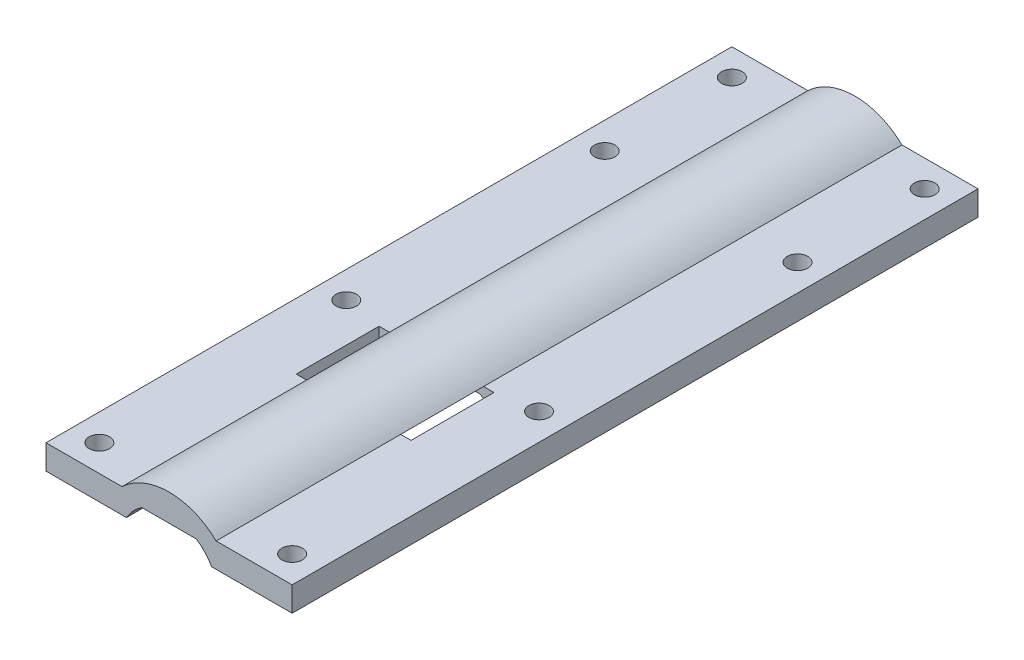
ISO-10303-21;
HEADER;
FILE_DESCRIPTION(('STEP AP214'),'2;1');
FILE_NAME('part.step','',(''),(''),'','','');
FILE_SCHEMA(('AUTOMOTIVE_DESIGN { 1 0 10303 214 1 1 1 1 }'));
ENDSEC;
DATA;
#1=APPLICATION_CONTEXT('core data for automotive mechanical design processes');
#2=APPLICATION_PROTOCOL_DEFINITION('international standard','automotive_design',2000,#1);
#3=PRODUCT_CONTEXT('',#1,'mechanical');
#4=PRODUCT('Part','Part','',(#3));
#5=PRODUCT_RELATED_PRODUCT_CATEGORY('part','',(#4));
#6=PRODUCT_DEFINITION_FORMATION('','',#4);
#7=PRODUCT_DEFINITION_CONTEXT('part definition',#1,'design');
#8=PRODUCT_DEFINITION('design','',#6,#7);
#9=PRODUCT_DEFINITION_SHAPE('','',#8);
#10=(LENGTH_UNIT() NAMED_UNIT(*) SI_UNIT(.MILLI.,.METRE.));
#11=(NAMED_UNIT(*) PLANE_ANGLE_UNIT() SI_UNIT($,.RADIAN.));
#12=(NAMED_UNIT(*) SI_UNIT($,.STERADIAN.) SOLID_ANGLE_UNIT());
#13=UNCERTAINTY_MEASURE_WITH_UNIT(LENGTH_MEASURE(1.E-05),#10,'distance_accuracy_value','');
#14=(GEOMETRIC_REPRESENTATION_CONTEXT(3) GLOBAL_UNCERTAINTY_ASSIGNED_CONTEXT((#13)) GLOBAL_UNIT_ASSIGNED_CONTEXT((#10,
#11,#12)) REPRESENTATION_CONTEXT('',''));
#15=CARTESIAN_POINT('',(0.,0.,0.));
#16=DIRECTION('',(0.,0.,1.));
#17=DIRECTION('',(1.,0.,0.));
#18=AXIS2_PLACEMENT_3D('',#15,#16,#17);
#19=CARTESIAN_POINT('',(0.,4.99999999999986,60.1));
#20=DIRECTION('',(0.,1.,0.));
#21=DIRECTION('',(-1.,0.,0.));
#22=AXIS2_PLACEMENT_3D('',#19,#20,#21);
#23=PLANE('',#22);
#24=DIRECTION('',(0.,0.,-1.));
#25=VECTOR('',#24,1.);
#26=CARTESIAN_POINT('',(-3.31662479035547,4.99999999999987,83.6));
#27=LINE('',#26,#25);
#28=CARTESIAN_POINT('',(-3.31662479035547,4.99999999999987,83.6));
#29=VERTEX_POINT('',#28);
#30=CARTESIAN_POINT('',(-3.31662479035547,4.99999999999987,61.1));
#31=VERTEX_POINT('',#30);
#32=EDGE_CURVE('E325',#29,#31,#27,.T.);
#33=ORIENTED_EDGE('',*,*,#32,.T.);
#34=DIRECTION('',(1.,0.,0.));
#35=VECTOR('',#34,1.);
#36=CARTESIAN_POINT('',(0.,4.99999999999986,61.1));
#37=LINE('',#36,#35);
#38=CARTESIAN_POINT('',(3.31662479035536,4.9999999999999,61.1));
#39=VERTEX_POINT('',#38);
#40=EDGE_CURVE('E249',#31,#39,#37,.T.);
#41=ORIENTED_EDGE('',*,*,#40,.T.);
#42=DIRECTION('',(0.,0.,-1.));
#43=VECTOR('',#42,1.);
#44=CARTESIAN_POINT('',(3.31662479035533,4.99999999999985,83.6));
#45=LINE('',#44,#43);
#46=CARTESIAN_POINT('',(3.31662479035533,4.99999999999985,83.6));
#47=VERTEX_POINT('',#46);
#48=EDGE_CURVE('E322',#47,#39,#45,.T.);
#49=ORIENTED_EDGE('',*,*,#48,.F.);
#50=DIRECTION('',(1.,0.,0.));
#51=VECTOR('',#50,1.);
#52=CARTESIAN_POINT('',(0.,4.99999999999986,83.6));
#53=LINE('',#52,#51);
#54=EDGE_CURVE('E299',#29,#47,#53,.T.);
#55=ORIENTED_EDGE('',*,*,#54,.F.);
#56=EDGE_LOOP('',(#33,#41,#49,#55));
#57=FACE_BOUND('',#56,.T.);
#58=ADVANCED_FACE('F37',(#57),#23,.F.);
#59=DIRECTION('',(0.,0.,-1.));
#60=VECTOR('',#59,1.);
#61=CARTESIAN_POINT('',(4.99999999999998,4.99999999999984,60.1));
#62=LINE('',#61,#60);
#63=CARTESIAN_POINT('',(4.99999999999998,4.99999999999984,51.));
#64=VERTEX_POINT('',#63);
#65=CARTESIAN_POINT('',(4.99999999999998,4.99999999999984,49.));
#66=VERTEX_POINT('',#65);
#67=EDGE_CURVE('E360',#64,#66,#62,.T.);
#68=ORIENTED_EDGE('',*,*,#67,.F.);
#69=DIRECTION('',(-1.,0.,0.));
#70=VECTOR('',#69,1.);
#71=CARTESIAN_POINT('',(0.,4.99999999999986,51.));
#72=LINE('',#71,#70);
#73=CARTESIAN_POINT('',(1.75783958312509,4.99999999999985,51.));
#74=VERTEX_POINT('',#73);
#75=EDGE_CURVE('E256',#64,#74,#72,.T.);
#76=ORIENTED_EDGE('',*,*,#75,.T.);
#77=DIRECTION('',(0.,0.,-1.));
#78=VECTOR('',#77,1.);
#79=CARTESIAN_POINT('',(1.75783958312509,4.99999999999985,60.1));
#80=LINE('',#79,#78);
#81=CARTESIAN_POINT('',(1.75783958312509,4.99999999999985,49.));
#82=VERTEX_POINT('',#81);
#83=EDGE_CURVE('E358',#74,#82,#80,.T.);
#84=ORIENTED_EDGE('',*,*,#83,.T.);
#85=DIRECTION('',(1.,0.,0.));
#86=VECTOR('',#85,1.);
#87=CARTESIAN_POINT('',(0.,4.99999999999986,49.));
#88=LINE('',#87,#86);
#89=EDGE_CURVE('E337',#82,#66,#88,.T.);
#90=ORIENTED_EDGE('',*,*,#89,.T.);
#91=EDGE_LOOP('',(#68,#76,#84,#90));
#92=FACE_BOUND('',#91,.T.);
#93=ADVANCED_FACE('F499',(#92),#23,.F.);
#94=CARTESIAN_POINT('',(0.,0.,49.));
#95=DIRECTION('',(0.,0.,1.));
#96=DIRECTION('',(1.,0.,0.));
#97=AXIS2_PLACEMENT_3D('',#94,#95,#96);
#98=PLANE('',#97);
#99=DIRECTION('',(0.,-1.,0.));
#100=VECTOR('',#99,1.);
#101=CARTESIAN_POINT('',(5.99999999999996,0.,49.));
#102=LINE('',#101,#100);
#103=CARTESIAN_POINT('',(5.99999999999997,3.99999999999984,49.));
#104=VERTEX_POINT('',#103);
#105=CARTESIAN_POINT('',(5.99999999999997,3.,49.));
#106=VERTEX_POINT('',#105);
#107=EDGE_CURVE('E331',#104,#106,#102,.T.);
#108=ORIENTED_EDGE('',*,*,#107,.F.);
#109=CARTESIAN_POINT('',(4.99999999999997,3.99999999999984,49.));
#110=DIRECTION('',(0.,0.,1.));
#111=DIRECTION('',(1.,0.,0.));
#112=AXIS2_PLACEMENT_3D('',#109,#110,#111);
#113=CIRCLE('',#112,1.);
#114=EDGE_CURVE('E334',#104,#66,#113,.T.);
#115=ORIENTED_EDGE('',*,*,#114,.T.);
#116=ORIENTED_EDGE('',*,*,#89,.F.);
#117=CARTESIAN_POINT('',(0.,0.,49.));
#118=DIRECTION('',(0.,0.,1.));
#119=DIRECTION('',(1.,0.,0.));
#120=AXIS2_PLACEMENT_3D('',#117,#118,#119);
#121=CIRCLE('',#120,5.29999999999999);
#122=CARTESIAN_POINT('',(4.36921045499068,3.,49.));
#123=VERTEX_POINT('',#122);
#124=EDGE_CURVE('E351',#82,#123,#121,.F.);
#125=ORIENTED_EDGE('',*,*,#124,.T.);
#126=DIRECTION('',(1.,0.,0.));
#127=VECTOR('',#126,1.);
#128=CARTESIAN_POINT('',(0.,3.,49.));
#129=LINE('',#128,#127);
#130=EDGE_CURVE('E368',#123,#106,#129,.T.);
#131=ORIENTED_EDGE('',*,*,#130,.T.);
#132=EDGE_LOOP('',(#108,#115,#116,#125,#131));
#133=FACE_BOUND('',#132,.T.);
#134=ADVANCED_FACE('F502',(#133),#98,.T.);
#135=CARTESIAN_POINT('',(0.,0.,22.));
#136=DIRECTION('',(0.,0.,-1.));
#137=DIRECTION('',(-1.,0.,0.));
#138=AXIS2_PLACEMENT_3D('',#135,#136,#137);
#139=CYLINDRICAL_SURFACE('',#138,5.29999999999999);
#140=ORIENTED_EDGE('',*,*,#83,.F.);
#141=CARTESIAN_POINT('',(0.,0.,51.));
#142=DIRECTION('',(0.,0.,-1.));
#143=DIRECTION('',(-1.,0.,0.));
#144=AXIS2_PLACEMENT_3D('',#141,#142,#143);
#145=CIRCLE('',#144,5.29999999999999);
#146=CARTESIAN_POINT('',(-1.75783958312505,4.99999999999986,51.));
#147=VERTEX_POINT('',#146);
#148=EDGE_CURVE('E259',#74,#147,#145,.F.);
#149=ORIENTED_EDGE('',*,*,#148,.T.);
#150=DIRECTION('',(0.,0.,-1.));
#151=VECTOR('',#150,1.);
#152=CARTESIAN_POINT('',(-1.75783958312505,4.99999999999986,60.1));
#153=LINE('',#152,#151);
#154=CARTESIAN_POINT('',(-1.75783958312505,4.99999999999986,49.));
#155=VERTEX_POINT('',#154);
#156=EDGE_CURVE('E356',#147,#155,#153,.T.);
#157=ORIENTED_EDGE('',*,*,#156,.T.);
#158=CARTESIAN_POINT('',(-4.36921045499068,3.,49.));
#159=VERTEX_POINT('',#158);
#160=EDGE_CURVE('E365',#159,#155,#121,.F.);
#161=ORIENTED_EDGE('',*,*,#160,.F.);
#162=DIRECTION('',(0.,0.,-1.));
#163=VECTOR('',#162,1.);
#164=CARTESIAN_POINT('',(-4.36921045499068,3.,22.));
#165=LINE('',#164,#163);
#166=CARTESIAN_POINT('',(-4.36921045499068,3.,0.));
#167=VERTEX_POINT('',#166);
#168=EDGE_CURVE('E416',#159,#167,#165,.T.);
#169=ORIENTED_EDGE('',*,*,#168,.T.);
#170=CARTESIAN_POINT('',(0.,0.,0.));
#171=DIRECTION('',(0.,0.,-1.));
#172=DIRECTION('',(1.,0.,0.));
#173=AXIS2_PLACEMENT_3D('',#170,#171,#172);
#174=CIRCLE('',#173,5.29999999999999);
#175=CARTESIAN_POINT('',(4.36921045499068,3.,0.));
#176=VERTEX_POINT('',#175);
#177=EDGE_CURVE('E397',#167,#176,#174,.T.);
#178=ORIENTED_EDGE('',*,*,#177,.T.);
#179=DIRECTION('',(0.,0.,-1.));
#180=VECTOR('',#179,1.);
#181=CARTESIAN_POINT('',(4.36921045499068,3.,22.));
#182=LINE('',#181,#180);
#183=EDGE_CURVE('E441',#123,#176,#182,.T.);
#184=ORIENTED_EDGE('',*,*,#183,.F.);
#185=ORIENTED_EDGE('',*,*,#124,.F.);
#186=EDGE_LOOP('',(#140,#149,#157,#161,#169,#178,#184,#185));
#187=FACE_BOUND('',#186,.T.);
#188=ADVANCED_FACE('F39',(#187),#139,.F.);
#189=CARTESIAN_POINT('',(4.36921045499068,3.,22.));
#190=DIRECTION('',(0.,1.,0.));
#191=DIRECTION('',(0.,0.,1.));
#192=AXIS2_PLACEMENT_3D('',#189,#190,#191);
#193=PLANE('',#192);
#194=CARTESIAN_POINT('',(11.75,3.,80.35));
#195=DIRECTION('',(0.,1.,0.));
#196=DIRECTION('',(0.,0.,1.));
#197=AXIS2_PLACEMENT_3D('',#194,#195,#196);
#198=CIRCLE('',#197,1.25000000000005);
#199=CARTESIAN_POINT('',(11.75,3.,81.6));
#200=VERTEX_POINT('',#199);
#201=EDGE_CURVE('E279',#200,#200,#198,.F.);
#202=ORIENTED_EDGE('',*,*,#201,.F.);
#203=EDGE_LOOP('',(#202));
#204=FACE_BOUND('',#203,.T.);
#205=CARTESIAN_POINT('',(11.75,3.,50.25));
#206=DIRECTION('',(0.,1.,0.));
#207=DIRECTION('',(0.,0.,1.));
#208=AXIS2_PLACEMENT_3D('',#205,#206,#207);
#209=CIRCLE('',#208,1.25000000000005);
#210=CARTESIAN_POINT('',(11.75,3.,51.5000000000001));
#211=VERTEX_POINT('',#210);
#212=EDGE_CURVE('E272',#211,#211,#209,.F.);
#213=ORIENTED_EDGE('',*,*,#212,.F.);
#214=EDGE_LOOP('',(#213));
#215=FACE_BOUND('',#214,.T.);
#216=CARTESIAN_POINT('',(11.75,3.,3.25));
#217=DIRECTION('',(0.,1.,0.));
#218=DIRECTION('',(0.,0.,1.));
#219=AXIS2_PLACEMENT_3D('',#216,#217,#218);
#220=CIRCLE('',#219,1.25);
#221=CARTESIAN_POINT('',(11.75,3.,4.5));
#222=VERTEX_POINT('',#221);
#223=EDGE_CURVE('E377',#222,#222,#220,.F.);
#224=ORIENTED_EDGE('',*,*,#223,.F.);
#225=EDGE_LOOP('',(#224));
#226=FACE_BOUND('',#225,.T.);
#227=CARTESIAN_POINT('',(11.75,3.,18.75));
#228=DIRECTION('',(0.,1.,0.));
#229=DIRECTION('',(0.,0.,1.));
#230=AXIS2_PLACEMENT_3D('',#227,#228,#229);
#231=CIRCLE('',#230,1.25);
#232=CARTESIAN_POINT('',(11.75,3.,20.));
#233=VERTEX_POINT('',#232);
#234=EDGE_CURVE('E394',#233,#233,#231,.F.);
#235=ORIENTED_EDGE('',*,*,#234,.F.);
#236=EDGE_LOOP('',(#235));
#237=FACE_BOUND('',#236,.T.);
#238=DIRECTION('',(0.,0.,-1.));
#239=VECTOR('',#238,1.);
#240=CARTESIAN_POINT('',(5.19615242270651,3.,83.6));
#241=LINE('',#240,#239);
#242=CARTESIAN_POINT('',(5.19615242270651,3.,83.6));
#243=VERTEX_POINT('',#242);
#244=CARTESIAN_POINT('',(5.19615242270651,3.,61.1));
#245=VERTEX_POINT('',#244);
#246=EDGE_CURVE('E319',#243,#245,#241,.T.);
#247=ORIENTED_EDGE('',*,*,#246,.T.);
#248=DIRECTION('',(-1.,0.,0.));
#249=VECTOR('',#248,1.);
#250=CARTESIAN_POINT('',(6.99999999999998,3.,61.1));
#251=LINE('',#250,#249);
#252=CARTESIAN_POINT('',(6.99999999999998,3.,61.1));
#253=VERTEX_POINT('',#252);
#254=EDGE_CURVE('E218',#253,#245,#251,.T.);
#255=ORIENTED_EDGE('',*,*,#254,.F.);
#256=DIRECTION('',(0.,0.,1.));
#257=VECTOR('',#256,1.);
#258=CARTESIAN_POINT('',(6.99999999999997,3.,51.));
#259=LINE('',#258,#257);
#260=CARTESIAN_POINT('',(6.99999999999997,3.,51.));
#261=VERTEX_POINT('',#260);
#262=EDGE_CURVE('E234',#261,#253,#259,.T.);
#263=ORIENTED_EDGE('',*,*,#262,.F.);
#264=DIRECTION('',(1.,0.,0.));
#265=VECTOR('',#264,1.);
#266=CARTESIAN_POINT('',(-7.00000000000003,3.,51.));
#267=LINE('',#266,#265);
#268=CARTESIAN_POINT('',(5.99999999999997,3.,51.));
#269=VERTEX_POINT('',#268);
#270=EDGE_CURVE('E228',#269,#261,#267,.T.);
#271=ORIENTED_EDGE('',*,*,#270,.F.);
#272=DIRECTION('',(0.,0.,-1.));
#273=VECTOR('',#272,1.);
#274=CARTESIAN_POINT('',(5.99999999999997,3.,60.1));
#275=LINE('',#274,#273);
#276=EDGE_CURVE('E349',#269,#106,#275,.T.);
#277=ORIENTED_EDGE('',*,*,#276,.T.);
#278=ORIENTED_EDGE('',*,*,#130,.F.);
#279=ORIENTED_EDGE('',*,*,#183,.T.);
#280=DIRECTION('',(1.,0.,0.));
#281=VECTOR('',#280,1.);
#282=CARTESIAN_POINT('',(4.36921045499068,3.,0.));
#283=LINE('',#282,#281);
#284=CARTESIAN_POINT('',(15.,3.,0.));
#285=VERTEX_POINT('',#284);
#286=EDGE_CURVE('E400',#176,#285,#283,.T.);
#287=ORIENTED_EDGE('',*,*,#286,.T.);
#288=DIRECTION('',(0.,0.,-1.));
#289=VECTOR('',#288,1.);
#290=CARTESIAN_POINT('',(15.,3.,22.));
#291=LINE('',#290,#289);
#292=CARTESIAN_POINT('',(15.,3.,83.6));
#293=VERTEX_POINT('',#292);
#294=EDGE_CURVE('E438',#293,#285,#291,.T.);
#295=ORIENTED_EDGE('',*,*,#294,.F.);
#296=DIRECTION('',(1.,0.,0.));
#297=VECTOR('',#296,1.);
#298=CARTESIAN_POINT('',(0.,3.,83.6));
#299=LINE('',#298,#297);
#300=EDGE_CURVE('E304',#243,#293,#299,.T.);
#301=ORIENTED_EDGE('',*,*,#300,.F.);
#302=EDGE_LOOP('',(#247,#255,#263,#271,#277,#278,#279,#287,#295,#301));
#303=FACE_BOUND('',#302,.T.);
#304=ADVANCED_FACE('F514',(#204,#215,#226,#237,#303),#193,.F.);
#305=CARTESIAN_POINT('',(15.,3.,22.));
#306=DIRECTION('',(-1.,0.,0.));
#307=DIRECTION('',(0.,0.,1.));
#308=AXIS2_PLACEMENT_3D('',#305,#306,#307);
#309=PLANE('',#308);
#310=DIRECTION('',(0.,1.,0.));
#311=VECTOR('',#310,1.);
#312=CARTESIAN_POINT('',(15.,3.,0.));
#313=LINE('',#312,#311);
#314=CARTESIAN_POINT('',(15.,6.,0.));
#315=VERTEX_POINT('',#314);
#316=EDGE_CURVE('E402',#285,#315,#313,.T.);
#317=ORIENTED_EDGE('',*,*,#316,.T.);
#318=DIRECTION('',(0.,0.,-1.));
#319=VECTOR('',#318,1.);
#320=CARTESIAN_POINT('',(15.,6.,22.));
#321=LINE('',#320,#319);
#322=CARTESIAN_POINT('',(15.,6.,83.6));
#323=VERTEX_POINT('',#322);
#324=EDGE_CURVE('E434',#323,#315,#321,.T.);
#325=ORIENTED_EDGE('',*,*,#324,.F.);
#326=DIRECTION('',(0.,1.,0.));
#327=VECTOR('',#326,1.);
#328=CARTESIAN_POINT('',(15.,0.,83.6));
#329=LINE('',#328,#327);
#330=EDGE_CURVE('E307',#293,#323,#329,.T.);
#331=ORIENTED_EDGE('',*,*,#330,.F.);
#332=ORIENTED_EDGE('',*,*,#294,.T.);
#333=EDGE_LOOP('',(#317,#325,#331,#332));
#334=FACE_BOUND('',#333,.T.);
#335=ADVANCED_FACE('F547',(#334),#309,.F.);
#336=CARTESIAN_POINT('',(15.,6.,22.));
#337=DIRECTION('',(0.,-1.,0.));
#338=DIRECTION('',(1.,0.,0.));
#339=AXIS2_PLACEMENT_3D('',#336,#337,#338);
#340=PLANE('',#339);
#341=CARTESIAN_POINT('',(11.75,6.,80.35));
#342=DIRECTION('',(0.,1.,0.));
#343=DIRECTION('',(-1.,0.,0.));
#344=AXIS2_PLACEMENT_3D('',#341,#342,#343);
#345=CIRCLE('',#344,1.25000000000005);
#346=CARTESIAN_POINT('',(10.5,6.,80.35));
#347=VERTEX_POINT('',#346);
#348=EDGE_CURVE('E267',#347,#347,#345,.T.);
#349=ORIENTED_EDGE('',*,*,#348,.F.);
#350=EDGE_LOOP('',(#349));
#351=FACE_BOUND('',#350,.T.);
#352=CARTESIAN_POINT('',(11.75,6.,50.25));
#353=DIRECTION('',(0.,1.,0.));
#354=DIRECTION('',(-1.,0.,0.));
#355=AXIS2_PLACEMENT_3D('',#352,#353,#354);
#356=CIRCLE('',#355,1.25000000000005);
#357=CARTESIAN_POINT('',(10.5,6.,50.25));
#358=VERTEX_POINT('',#357);
#359=EDGE_CURVE('E276',#358,#358,#356,.T.);
#360=ORIENTED_EDGE('',*,*,#359,.F.);
#361=EDGE_LOOP('',(#360));
#362=FACE_BOUND('',#361,.T.);
#363=CARTESIAN_POINT('',(11.75,6.,3.25));
#364=DIRECTION('',(0.,1.,0.));
#365=DIRECTION('',(-1.,0.,0.));
#366=AXIS2_PLACEMENT_3D('',#363,#364,#365);
#367=CIRCLE('',#366,1.25);
#368=CARTESIAN_POINT('',(10.5,6.,3.25));
#369=VERTEX_POINT('',#368);
#370=EDGE_CURVE('E374',#369,#369,#367,.T.);
#371=ORIENTED_EDGE('',*,*,#370,.F.);
#372=EDGE_LOOP('',(#371));
#373=FACE_BOUND('',#372,.T.);
#374=CARTESIAN_POINT('',(11.75,6.,18.75));
#375=DIRECTION('',(0.,1.,0.));
#376=DIRECTION('',(-1.,0.,0.));
#377=AXIS2_PLACEMENT_3D('',#374,#375,#376);
#378=CIRCLE('',#377,1.25);
#379=CARTESIAN_POINT('',(10.5,6.,18.75));
#380=VERTEX_POINT('',#379);
#381=EDGE_CURVE('E381',#380,#380,#378,.T.);
#382=ORIENTED_EDGE('',*,*,#381,.F.);
#383=EDGE_LOOP('',(#382));
#384=FACE_BOUND('',#383,.T.);
#385=DIRECTION('',(0.,0.,-1.));
#386=VECTOR('',#385,1.);
#387=CARTESIAN_POINT('',(6.99999999999997,5.99999999999993,51.));
#388=LINE('',#387,#386);
#389=CARTESIAN_POINT('',(6.99999999999998,5.99999999999993,61.1));
#390=VERTEX_POINT('',#389);
#391=CARTESIAN_POINT('',(6.99999999999997,5.99999999999993,51.));
#392=VERTEX_POINT('',#391);
#393=EDGE_CURVE('E243',#390,#392,#388,.T.);
#394=ORIENTED_EDGE('',*,*,#393,.F.);
#395=DIRECTION('',(1.,0.,0.));
#396=VECTOR('',#395,1.);
#397=CARTESIAN_POINT('',(6.99999999999998,5.99999999999993,61.1));
#398=LINE('',#397,#396);
#399=CARTESIAN_POINT('',(5.73498038357604,5.99999999999993,61.1));
#400=VERTEX_POINT('',#399);
#401=EDGE_CURVE('E522',#400,#390,#398,.T.);
#402=ORIENTED_EDGE('',*,*,#401,.F.);
#403=DIRECTION('',(0.,0.,-1.));
#404=VECTOR('',#403,1.);
#405=CARTESIAN_POINT('',(5.73498038357595,6.,22.));
#406=LINE('',#405,#404);
#407=CARTESIAN_POINT('',(5.73498038357595,6.,83.6));
#408=VERTEX_POINT('',#407);
#409=EDGE_CURVE('E431',#408,#400,#406,.T.);
#410=ORIENTED_EDGE('',*,*,#409,.F.);
#411=DIRECTION('',(-1.,0.,0.));
#412=VECTOR('',#411,1.);
#413=CARTESIAN_POINT('',(0.,6.,83.6));
#414=LINE('',#413,#412);
#415=EDGE_CURVE('E310',#323,#408,#414,.T.);
#416=ORIENTED_EDGE('',*,*,#415,.F.);
#417=ORIENTED_EDGE('',*,*,#324,.T.);
#418=DIRECTION('',(-1.,0.,0.));
#419=VECTOR('',#418,1.);
#420=CARTESIAN_POINT('',(15.,6.,0.));
#421=LINE('',#420,#419);
#422=CARTESIAN_POINT('',(5.73498038357595,6.,0.));
#423=VERTEX_POINT('',#422);
#424=EDGE_CURVE('E404',#315,#423,#421,.T.);
#425=ORIENTED_EDGE('',*,*,#424,.T.);
#426=CARTESIAN_POINT('',(5.73498038357595,6.,51.));
#427=VERTEX_POINT('',#426);
#428=EDGE_CURVE('E429',#427,#423,#406,.T.);
#429=ORIENTED_EDGE('',*,*,#428,.F.);
#430=DIRECTION('',(-1.,0.,0.));
#431=VECTOR('',#430,1.);
#432=CARTESIAN_POINT('',(-7.00000000000002,5.99999999999993,51.));
#433=LINE('',#432,#431);
#434=EDGE_CURVE('E52',#392,#427,#433,.T.);
#435=ORIENTED_EDGE('',*,*,#434,.F.);
#436=EDGE_LOOP('',(#394,#402,#410,#416,#417,#425,#429,#435));
#437=FACE_BOUND('',#436,.T.);
#438=ADVANCED_FACE('F539',(#351,#362,#373,#384,#437),#340,.F.);
#439=CARTESIAN_POINT('',(0.,0.,22.));
#440=DIRECTION('',(0.,0.,-1.));
#441=DIRECTION('',(-1.,0.,0.));
#442=AXIS2_PLACEMENT_3D('',#439,#440,#441);
#443=CYLINDRICAL_SURFACE('',#442,8.30000000000006);
#444=CARTESIAN_POINT('',(0.,0.,0.));
#445=DIRECTION('',(0.,0.,1.));
#446=DIRECTION('',(1.,0.,0.));
#447=AXIS2_PLACEMENT_3D('',#444,#445,#446);
#448=CIRCLE('',#447,8.30000000000006);
#449=CARTESIAN_POINT('',(-5.73498038357596,6.,0.));
#450=VERTEX_POINT('',#449);
#451=EDGE_CURVE('E407',#423,#450,#448,.T.);
#452=ORIENTED_EDGE('',*,*,#451,.T.);
#453=DIRECTION('',(0.,0.,-1.));
#454=VECTOR('',#453,1.);
#455=CARTESIAN_POINT('',(-5.73498038357596,6.,22.));
#456=LINE('',#455,#454);
#457=CARTESIAN_POINT('',(-5.73498038357596,6.,51.));
#458=VERTEX_POINT('',#457);
#459=EDGE_CURVE('E425',#458,#450,#456,.T.);
#460=ORIENTED_EDGE('',*,*,#459,.F.);
#461=CARTESIAN_POINT('',(-5.73498038357596,5.99999999999992,61.1));
#462=VERTEX_POINT('',#461);
#463=EDGE_CURVE('E430',#462,#458,#456,.T.);
#464=ORIENTED_EDGE('',*,*,#463,.F.);
#465=CARTESIAN_POINT('',(-5.73498038357596,6.,83.6));
#466=VERTEX_POINT('',#465);
#467=EDGE_CURVE('E426',#466,#462,#456,.T.);
#468=ORIENTED_EDGE('',*,*,#467,.F.);
#469=CARTESIAN_POINT('',(0.,0.,83.6));
#470=DIRECTION('',(0.,0.,1.));
#471=DIRECTION('',(1.,0.,0.));
#472=AXIS2_PLACEMENT_3D('',#469,#470,#471);
#473=CIRCLE('',#472,8.30000000000006);
#474=EDGE_CURVE('E313',#408,#466,#473,.T.);
#475=ORIENTED_EDGE('',*,*,#474,.F.);
#476=ORIENTED_EDGE('',*,*,#409,.T.);
#477=EDGE_CURVE('E435',#400,#427,#406,.T.);
#478=ORIENTED_EDGE('',*,*,#477,.T.);
#479=ORIENTED_EDGE('',*,*,#428,.T.);
#480=EDGE_LOOP('',(#452,#460,#464,#468,#475,#476,#478,#479));
#481=FACE_BOUND('',#480,.T.);
#482=ADVANCED_FACE('F536',(#481),#443,.T.);
#483=CARTESIAN_POINT('',(-5.73498038357596,6.,22.));
#484=DIRECTION('',(0.,-1.,0.));
#485=DIRECTION('',(1.,0.,0.));
#486=AXIS2_PLACEMENT_3D('',#483,#484,#485);
#487=PLANE('',#486);
#488=CARTESIAN_POINT('',(-11.75,6.00000000000001,50.25));
#489=DIRECTION('',(0.,1.,0.));
#490=DIRECTION('',(-1.,0.,0.));
#491=AXIS2_PLACEMENT_3D('',#488,#489,#490);
#492=CIRCLE('',#491,1.25000000000005);
#493=CARTESIAN_POINT('',(-13.,6.00000000000001,50.25));
#494=VERTEX_POINT('',#493);
#495=EDGE_CURVE('E268',#494,#494,#492,.T.);
#496=ORIENTED_EDGE('',*,*,#495,.F.);
#497=EDGE_LOOP('',(#496));
#498=FACE_BOUND('',#497,.T.);
#499=CARTESIAN_POINT('',(-11.75,6.00000000000001,80.35));
#500=DIRECTION('',(0.,1.,0.));
#501=DIRECTION('',(-1.,0.,0.));
#502=AXIS2_PLACEMENT_3D('',#499,#500,#501);
#503=CIRCLE('',#502,1.25000000000005);
#504=CARTESIAN_POINT('',(-13.,6.00000000000001,80.35));
#505=VERTEX_POINT('',#504);
#506=EDGE_CURVE('E275',#505,#505,#503,.T.);
#507=ORIENTED_EDGE('',*,*,#506,.F.);
#508=EDGE_LOOP('',(#507));
#509=FACE_BOUND('',#508,.T.);
#510=CARTESIAN_POINT('',(-11.75,6.,18.75));
#511=DIRECTION('',(0.,1.,0.));
#512=DIRECTION('',(-1.,0.,0.));
#513=AXIS2_PLACEMENT_3D('',#510,#511,#512);
#514=CIRCLE('',#513,1.25);
#515=CARTESIAN_POINT('',(-13.,6.,18.75));
#516=VERTEX_POINT('',#515);
#517=EDGE_CURVE('E373',#516,#516,#514,.T.);
#518=ORIENTED_EDGE('',*,*,#517,.F.);
#519=EDGE_LOOP('',(#518));
#520=FACE_BOUND('',#519,.T.);
#521=CARTESIAN_POINT('',(-11.75,6.,3.25));
#522=DIRECTION('',(0.,1.,0.));
#523=DIRECTION('',(-1.,0.,0.));
#524=AXIS2_PLACEMENT_3D('',#521,#522,#523);
#525=CIRCLE('',#524,1.25);
#526=CARTESIAN_POINT('',(-13.,6.,3.25));
#527=VERTEX_POINT('',#526);
#528=EDGE_CURVE('E382',#527,#527,#525,.T.);
#529=ORIENTED_EDGE('',*,*,#528,.F.);
#530=EDGE_LOOP('',(#529));
#531=FACE_BOUND('',#530,.T.);
#532=ORIENTED_EDGE('',*,*,#467,.T.);
#533=CARTESIAN_POINT('',(-7.00000000000003,5.99999999999992,61.1));
#534=VERTEX_POINT('',#533);
#535=EDGE_CURVE('E526',#534,#462,#398,.T.);
#536=ORIENTED_EDGE('',*,*,#535,.F.);
#537=DIRECTION('',(0.,0.,1.));
#538=VECTOR('',#537,1.);
#539=CARTESIAN_POINT('',(-7.00000000000003,5.99999999999993,61.1));
#540=LINE('',#539,#538);
#541=CARTESIAN_POINT('',(-7.00000000000003,5.99999999999993,51.));
#542=VERTEX_POINT('',#541);
#543=EDGE_CURVE('E528',#542,#534,#540,.T.);
#544=ORIENTED_EDGE('',*,*,#543,.F.);
#545=EDGE_CURVE('E214',#458,#542,#433,.T.);
#546=ORIENTED_EDGE('',*,*,#545,.F.);
#547=ORIENTED_EDGE('',*,*,#459,.T.);
#548=DIRECTION('',(-1.,0.,0.));
#549=VECTOR('',#548,1.);
#550=CARTESIAN_POINT('',(-5.73498038357596,6.,0.));
#551=LINE('',#550,#549);
#552=CARTESIAN_POINT('',(-15.,6.,0.));
#553=VERTEX_POINT('',#552);
#554=EDGE_CURVE('E410',#450,#553,#551,.T.);
#555=ORIENTED_EDGE('',*,*,#554,.T.);
#556=DIRECTION('',(0.,0.,-1.));
#557=VECTOR('',#556,1.);
#558=CARTESIAN_POINT('',(-15.,6.,22.));
#559=LINE('',#558,#557);
#560=CARTESIAN_POINT('',(-15.,6.,83.6));
#561=VERTEX_POINT('',#560);
#562=EDGE_CURVE('E422',#561,#553,#559,.T.);
#563=ORIENTED_EDGE('',*,*,#562,.F.);
#564=DIRECTION('',(-1.,0.,0.));
#565=VECTOR('',#564,1.);
#566=CARTESIAN_POINT('',(0.,6.,83.6));
#567=LINE('',#566,#565);
#568=EDGE_CURVE('E316',#466,#561,#567,.T.);
#569=ORIENTED_EDGE('',*,*,#568,.F.);
#570=EDGE_LOOP('',(#532,#536,#544,#546,#547,#555,#563,#569));
#571=FACE_BOUND('',#570,.T.);
#572=ADVANCED_FACE('F533',(#498,#509,#520,#531,#571),#487,.F.);
#573=CARTESIAN_POINT('',(-15.,6.,22.));
#574=DIRECTION('',(1.,0.,0.));
#575=DIRECTION('',(0.,1.,0.));
#576=AXIS2_PLACEMENT_3D('',#573,#574,#575);
#577=PLANE('',#576);
#578=DIRECTION('',(0.,-1.,0.));
#579=VECTOR('',#578,1.);
#580=CARTESIAN_POINT('',(-15.,6.,0.));
#581=LINE('',#580,#579);
#582=CARTESIAN_POINT('',(-15.,3.,0.));
#583=VERTEX_POINT('',#582);
#584=EDGE_CURVE('E412',#553,#583,#581,.T.);
#585=ORIENTED_EDGE('',*,*,#584,.T.);
#586=DIRECTION('',(0.,0.,-1.));
#587=VECTOR('',#586,1.);
#588=CARTESIAN_POINT('',(-15.,3.,22.));
#589=LINE('',#588,#587);
#590=CARTESIAN_POINT('',(-15.,3.,83.6));
#591=VERTEX_POINT('',#590);
#592=EDGE_CURVE('E419',#591,#583,#589,.T.);
#593=ORIENTED_EDGE('',*,*,#592,.F.);
#594=DIRECTION('',(0.,-1.,0.));
#595=VECTOR('',#594,1.);
#596=CARTESIAN_POINT('',(-15.,0.,83.6));
#597=LINE('',#596,#595);
#598=EDGE_CURVE('E291',#561,#591,#597,.T.);
#599=ORIENTED_EDGE('',*,*,#598,.F.);
#600=ORIENTED_EDGE('',*,*,#562,.T.);
#601=EDGE_LOOP('',(#585,#593,#599,#600));
#602=FACE_BOUND('',#601,.T.);
#603=ADVANCED_FACE('F467',(#602),#577,.F.);
#604=CARTESIAN_POINT('',(-15.,3.,22.));
#605=DIRECTION('',(0.,1.,0.));
#606=DIRECTION('',(0.,0.,1.));
#607=AXIS2_PLACEMENT_3D('',#604,#605,#606);
#608=PLANE('',#607);
#609=CARTESIAN_POINT('',(-11.75,3.,50.25));
#610=DIRECTION('',(0.,1.,0.));
#611=DIRECTION('',(0.,0.,1.));
#612=AXIS2_PLACEMENT_3D('',#609,#610,#611);
#613=CIRCLE('',#612,1.25000000000005);
#614=CARTESIAN_POINT('',(-11.75,3.,51.5000000000001));
#615=VERTEX_POINT('',#614);
#616=EDGE_CURVE('E271',#615,#615,#613,.F.);
#617=ORIENTED_EDGE('',*,*,#616,.F.);
#618=EDGE_LOOP('',(#617));
#619=FACE_BOUND('',#618,.T.);
#620=CARTESIAN_POINT('',(-11.75,3.,80.35));
#621=DIRECTION('',(0.,1.,0.));
#622=DIRECTION('',(0.,0.,1.));
#623=AXIS2_PLACEMENT_3D('',#620,#621,#622);
#624=CIRCLE('',#623,1.25000000000005);
#625=CARTESIAN_POINT('',(-11.75,3.,81.6));
#626=VERTEX_POINT('',#625);
#627=EDGE_CURVE('E288',#626,#626,#624,.F.);
#628=ORIENTED_EDGE('',*,*,#627,.F.);
#629=EDGE_LOOP('',(#628));
#630=FACE_BOUND('',#629,.T.);
#631=CARTESIAN_POINT('',(-11.75,3.,18.75));
#632=DIRECTION('',(0.,1.,0.));
#633=DIRECTION('',(0.,0.,1.));
#634=AXIS2_PLACEMENT_3D('',#631,#632,#633);
#635=CIRCLE('',#634,1.25);
#636=CARTESIAN_POINT('',(-11.75,3.,20.));
#637=VERTEX_POINT('',#636);
#638=EDGE_CURVE('E385',#637,#637,#635,.F.);
#639=ORIENTED_EDGE('',*,*,#638,.F.);
#640=EDGE_LOOP('',(#639));
#641=FACE_BOUND('',#640,.T.);
#642=CARTESIAN_POINT('',(-11.75,3.,3.25));
#643=DIRECTION('',(0.,1.,0.));
#644=DIRECTION('',(0.,0.,1.));
#645=AXIS2_PLACEMENT_3D('',#642,#643,#644);
#646=CIRCLE('',#645,1.25);
#647=CARTESIAN_POINT('',(-11.75,3.,4.5));
#648=VERTEX_POINT('',#647);
#649=EDGE_CURVE('E378',#648,#648,#646,.F.);
#650=ORIENTED_EDGE('',*,*,#649,.F.);
#651=EDGE_LOOP('',(#650));
#652=FACE_BOUND('',#651,.T.);
#653=DIRECTION('',(0.,0.,-1.));
#654=VECTOR('',#653,1.);
#655=CARTESIAN_POINT('',(-7.00000000000003,3.,61.1));
#656=LINE('',#655,#654);
#657=CARTESIAN_POINT('',(-7.00000000000003,3.,61.1));
#658=VERTEX_POINT('',#657);
#659=CARTESIAN_POINT('',(-7.00000000000003,3.,51.));
#660=VERTEX_POINT('',#659);
#661=EDGE_CURVE('E222',#658,#660,#656,.T.);
#662=ORIENTED_EDGE('',*,*,#661,.F.);
#663=CARTESIAN_POINT('',(-5.19615242270666,3.,61.1));
#664=VERTEX_POINT('',#663);
#665=EDGE_CURVE('E237',#664,#658,#251,.T.);
#666=ORIENTED_EDGE('',*,*,#665,.F.);
#667=DIRECTION('',(0.,0.,-1.));
#668=VECTOR('',#667,1.);
#669=CARTESIAN_POINT('',(-5.19615242270666,3.,83.6));
#670=LINE('',#669,#668);
#671=CARTESIAN_POINT('',(-5.19615242270666,3.,83.6));
#672=VERTEX_POINT('',#671);
#673=EDGE_CURVE('E328',#672,#664,#670,.T.);
#674=ORIENTED_EDGE('',*,*,#673,.F.);
#675=DIRECTION('',(1.,0.,0.));
#676=VECTOR('',#675,1.);
#677=CARTESIAN_POINT('',(0.,3.,83.6));
#678=LINE('',#677,#676);
#679=EDGE_CURVE('E294',#591,#672,#678,.T.);
#680=ORIENTED_EDGE('',*,*,#679,.F.);
#681=ORIENTED_EDGE('',*,*,#592,.T.);
#682=DIRECTION('',(1.,0.,0.));
#683=VECTOR('',#682,1.);
#684=CARTESIAN_POINT('',(-15.,3.,0.));
#685=LINE('',#684,#683);
#686=EDGE_CURVE('E414',#583,#167,#685,.T.);
#687=ORIENTED_EDGE('',*,*,#686,.T.);
#688=ORIENTED_EDGE('',*,*,#168,.F.);
#689=DIRECTION('',(1.,0.,0.));
#690=VECTOR('',#689,1.);
#691=CARTESIAN_POINT('',(0.,3.,49.));
#692=LINE('',#691,#690);
#693=CARTESIAN_POINT('',(-6.00000000000003,3.,49.));
#694=VERTEX_POINT('',#693);
#695=EDGE_CURVE('E371',#694,#159,#692,.T.);
#696=ORIENTED_EDGE('',*,*,#695,.F.);
#697=DIRECTION('',(0.,0.,-1.));
#698=VECTOR('',#697,1.);
#699=CARTESIAN_POINT('',(-6.00000000000003,3.,60.1));
#700=LINE('',#699,#698);
#701=CARTESIAN_POINT('',(-6.00000000000003,3.,51.));
#702=VERTEX_POINT('',#701);
#703=EDGE_CURVE('E233',#702,#694,#700,.T.);
#704=ORIENTED_EDGE('',*,*,#703,.F.);
#705=EDGE_CURVE('E211',#660,#702,#267,.T.);
#706=ORIENTED_EDGE('',*,*,#705,.F.);
#707=EDGE_LOOP('',(#662,#666,#674,#680,#681,#687,#688,#696,#704,#706));
#708=FACE_BOUND('',#707,.T.);
#709=ADVANCED_FACE('F231',(#619,#630,#641,#652,#708),#608,.F.);
#710=CARTESIAN_POINT('',(0.,0.,0.));
#711=DIRECTION('',(0.,0.,1.));
#712=DIRECTION('',(1.,0.,0.));
#713=AXIS2_PLACEMENT_3D('',#710,#711,#712);
#714=PLANE('',#713);
#715=ORIENTED_EDGE('',*,*,#177,.F.);
#716=ORIENTED_EDGE('',*,*,#686,.F.);
#717=ORIENTED_EDGE('',*,*,#584,.F.);
#718=ORIENTED_EDGE('',*,*,#554,.F.);
#719=ORIENTED_EDGE('',*,*,#451,.F.);
#720=ORIENTED_EDGE('',*,*,#424,.F.);
#721=ORIENTED_EDGE('',*,*,#316,.F.);
#722=ORIENTED_EDGE('',*,*,#286,.F.);
#723=EDGE_LOOP('',(#715,#716,#717,#718,#719,#720,#721,#722));
#724=FACE_BOUND('',#723,.T.);
#725=ADVANCED_FACE('F472',(#724),#714,.F.);
#726=CARTESIAN_POINT('',(-11.75,-0.535533905932744,3.25));
#727=DIRECTION('',(0.,1.,0.));
#728=DIRECTION('',(-1.,0.,0.));
#729=AXIS2_PLACEMENT_3D('',#726,#727,#728);
#730=CYLINDRICAL_SURFACE('',#729,1.25);
#731=ORIENTED_EDGE('',*,*,#649,.T.);
#732=EDGE_LOOP('',(#731));
#733=FACE_BOUND('',#732,.T.);
#734=ORIENTED_EDGE('',*,*,#528,.T.);
#735=EDGE_LOOP('',(#734));
#736=FACE_BOUND('',#735,.T.);
#737=ADVANCED_FACE('F858',(#733,#736),#730,.F.);
#738=CARTESIAN_POINT('',(-11.75,-0.535533905932744,18.75));
#739=DIRECTION('',(0.,1.,0.));
#740=DIRECTION('',(-1.,0.,0.));
#741=AXIS2_PLACEMENT_3D('',#738,#739,#740);
#742=CYLINDRICAL_SURFACE('',#741,1.25);
#743=ORIENTED_EDGE('',*,*,#638,.T.);
#744=EDGE_LOOP('',(#743));
#745=FACE_BOUND('',#744,.T.);
#746=ORIENTED_EDGE('',*,*,#517,.T.);
#747=EDGE_LOOP('',(#746));
#748=FACE_BOUND('',#747,.T.);
#749=ADVANCED_FACE('F848',(#745,#748),#742,.F.);
#750=CARTESIAN_POINT('',(11.75,-0.535533905932741,18.75));
#751=DIRECTION('',(0.,1.,0.));
#752=DIRECTION('',(-1.,0.,0.));
#753=AXIS2_PLACEMENT_3D('',#750,#751,#752);
#754=CYLINDRICAL_SURFACE('',#753,1.25);
#755=ORIENTED_EDGE('',*,*,#234,.T.);
#756=EDGE_LOOP('',(#755));
#757=FACE_BOUND('',#756,.T.);
#758=ORIENTED_EDGE('',*,*,#381,.T.);
#759=EDGE_LOOP('',(#758));
#760=FACE_BOUND('',#759,.T.);
#761=ADVANCED_FACE('F837',(#757,#760),#754,.F.);
#762=CARTESIAN_POINT('',(11.75,-0.535533905932741,3.25));
#763=DIRECTION('',(0.,1.,0.));
#764=DIRECTION('',(-1.,0.,0.));
#765=AXIS2_PLACEMENT_3D('',#762,#763,#764);
#766=CYLINDRICAL_SURFACE('',#765,1.25);
#767=ORIENTED_EDGE('',*,*,#223,.T.);
#768=EDGE_LOOP('',(#767));
#769=FACE_BOUND('',#768,.T.);
#770=ORIENTED_EDGE('',*,*,#370,.T.);
#771=EDGE_LOOP('',(#770));
#772=FACE_BOUND('',#771,.T.);
#773=ADVANCED_FACE('F820',(#769,#772),#766,.F.);
#774=DIRECTION('',(1.,0.,0.));
#775=VECTOR('',#774,1.);
#776=CARTESIAN_POINT('',(0.,4.99999999999986,49.));
#777=LINE('',#776,#775);
#778=CARTESIAN_POINT('',(-5.00000000000002,4.99999999999988,49.));
#779=VERTEX_POINT('',#778);
#780=EDGE_CURVE('E340',#779,#155,#777,.T.);
#781=ORIENTED_EDGE('',*,*,#780,.F.);
#782=CARTESIAN_POINT('',(-5.00000000000003,3.99999999999988,49.));
#783=DIRECTION('',(0.,0.,1.));
#784=DIRECTION('',(1.,0.,0.));
#785=AXIS2_PLACEMENT_3D('',#782,#783,#784);
#786=CIRCLE('',#785,1.);
#787=CARTESIAN_POINT('',(-6.00000000000003,3.99999999999988,49.));
#788=VERTEX_POINT('',#787);
#789=EDGE_CURVE('E343',#779,#788,#786,.T.);
#790=ORIENTED_EDGE('',*,*,#789,.T.);
#791=DIRECTION('',(0.,1.,0.));
#792=VECTOR('',#791,1.);
#793=CARTESIAN_POINT('',(-6.00000000000004,0.,49.));
#794=LINE('',#793,#792);
#795=EDGE_CURVE('E346',#694,#788,#794,.T.);
#796=ORIENTED_EDGE('',*,*,#795,.F.);
#797=ORIENTED_EDGE('',*,*,#695,.T.);
#798=ORIENTED_EDGE('',*,*,#160,.T.);
#799=EDGE_LOOP('',(#781,#790,#796,#797,#798));
#800=FACE_BOUND('',#799,.T.);
#801=ADVANCED_FACE('F482',(#800),#98,.T.);
#802=CARTESIAN_POINT('',(-6.00000000000004,0.,60.1));
#803=DIRECTION('',(-1.,0.,0.));
#804=DIRECTION('',(0.,-1.,0.));
#805=AXIS2_PLACEMENT_3D('',#802,#803,#804);
#806=PLANE('',#805);
#807=DIRECTION('',(0.,0.,-1.));
#808=VECTOR('',#807,1.);
#809=CARTESIAN_POINT('',(-6.00000000000003,3.99999999999988,60.1));
#810=LINE('',#809,#808);
#811=CARTESIAN_POINT('',(-6.00000000000003,3.99999999999988,51.));
#812=VERTEX_POINT('',#811);
#813=EDGE_CURVE('E352',#812,#788,#810,.T.);
#814=ORIENTED_EDGE('',*,*,#813,.F.);
#815=DIRECTION('',(0.,-1.,0.));
#816=VECTOR('',#815,1.);
#817=CARTESIAN_POINT('',(-6.00000000000004,0.,51.));
#818=LINE('',#817,#816);
#819=EDGE_CURVE('E265',#812,#702,#818,.T.);
#820=ORIENTED_EDGE('',*,*,#819,.T.);
#821=ORIENTED_EDGE('',*,*,#703,.T.);
#822=ORIENTED_EDGE('',*,*,#795,.T.);
#823=EDGE_LOOP('',(#814,#820,#821,#822));
#824=FACE_BOUND('',#823,.T.);
#825=ADVANCED_FACE('F494',(#824),#806,.F.);
#826=CARTESIAN_POINT('',(-5.00000000000003,3.99999999999988,60.1));
#827=DIRECTION('',(0.,0.,-1.));
#828=DIRECTION('',(-1.,0.,0.));
#829=AXIS2_PLACEMENT_3D('',#826,#827,#828);
#830=CYLINDRICAL_SURFACE('',#829,1.);
#831=CARTESIAN_POINT('',(-5.00000000000003,3.99999999999988,51.));
#832=DIRECTION('',(0.,0.,-1.));
#833=DIRECTION('',(-1.,0.,0.));
#834=AXIS2_PLACEMENT_3D('',#831,#832,#833);
#835=CIRCLE('',#834,1.);
#836=CARTESIAN_POINT('',(-5.00000000000002,4.99999999999988,51.));
#837=VERTEX_POINT('',#836);
#838=EDGE_CURVE('E263',#812,#837,#835,.T.);
#839=ORIENTED_EDGE('',*,*,#838,.F.);
#840=ORIENTED_EDGE('',*,*,#813,.T.);
#841=ORIENTED_EDGE('',*,*,#789,.F.);
#842=DIRECTION('',(0.,0.,-1.));
#843=VECTOR('',#842,1.);
#844=CARTESIAN_POINT('',(-5.00000000000002,4.99999999999988,60.1));
#845=LINE('',#844,#843);
#846=EDGE_CURVE('E354',#837,#779,#845,.T.);
#847=ORIENTED_EDGE('',*,*,#846,.F.);
#848=EDGE_LOOP('',(#839,#840,#841,#847));
#849=FACE_BOUND('',#848,.T.);
#850=ADVANCED_FACE('F491',(#849),#830,.F.);
#851=ORIENTED_EDGE('',*,*,#156,.F.);
#852=EDGE_CURVE('E260',#147,#837,#72,.T.);
#853=ORIENTED_EDGE('',*,*,#852,.T.);
#854=ORIENTED_EDGE('',*,*,#846,.T.);
#855=ORIENTED_EDGE('',*,*,#780,.T.);
#856=EDGE_LOOP('',(#851,#853,#854,#855));
#857=FACE_BOUND('',#856,.T.);
#858=ADVANCED_FACE('F486',(#857),#23,.F.);
#859=CARTESIAN_POINT('',(4.99999999999997,3.99999999999984,60.1));
#860=DIRECTION('',(0.,0.,-1.));
#861=DIRECTION('',(-1.,0.,0.));
#862=AXIS2_PLACEMENT_3D('',#859,#860,#861);
#863=CYLINDRICAL_SURFACE('',#862,1.);
#864=CARTESIAN_POINT('',(4.99999999999997,3.99999999999984,51.));
#865=DIRECTION('',(0.,0.,-1.));
#866=DIRECTION('',(-1.,0.,0.));
#867=AXIS2_PLACEMENT_3D('',#864,#865,#866);
#868=CIRCLE('',#867,1.);
#869=CARTESIAN_POINT('',(5.99999999999997,3.99999999999984,51.));
#870=VERTEX_POINT('',#869);
#871=EDGE_CURVE('E254',#64,#870,#868,.T.);
#872=ORIENTED_EDGE('',*,*,#871,.F.);
#873=ORIENTED_EDGE('',*,*,#67,.T.);
#874=ORIENTED_EDGE('',*,*,#114,.F.);
#875=DIRECTION('',(0.,0.,-1.));
#876=VECTOR('',#875,1.);
#877=CARTESIAN_POINT('',(5.99999999999997,3.99999999999984,60.1));
#878=LINE('',#877,#876);
#879=EDGE_CURVE('E362',#870,#104,#878,.T.);
#880=ORIENTED_EDGE('',*,*,#879,.F.);
#881=EDGE_LOOP('',(#872,#873,#874,#880));
#882=FACE_BOUND('',#881,.T.);
#883=ADVANCED_FACE('F507',(#882),#863,.F.);
#884=CARTESIAN_POINT('',(5.99999999999996,0.,60.1));
#885=DIRECTION('',(1.,0.,0.));
#886=DIRECTION('',(0.,1.,0.));
#887=AXIS2_PLACEMENT_3D('',#884,#885,#886);
#888=PLANE('',#887);
#889=ORIENTED_EDGE('',*,*,#276,.F.);
#890=DIRECTION('',(0.,1.,0.));
#891=VECTOR('',#890,1.);
#892=CARTESIAN_POINT('',(5.99999999999996,0.,51.));
#893=LINE('',#892,#891);
#894=EDGE_CURVE('E11',#269,#870,#893,.T.);
#895=ORIENTED_EDGE('',*,*,#894,.T.);
#896=ORIENTED_EDGE('',*,*,#879,.T.);
#897=ORIENTED_EDGE('',*,*,#107,.T.);
#898=EDGE_LOOP('',(#889,#895,#896,#897));
#899=FACE_BOUND('',#898,.T.);
#900=ADVANCED_FACE('F511',(#899),#888,.F.);
#901=CARTESIAN_POINT('',(0.,0.,83.6));
#902=DIRECTION('',(0.,0.,-1.));
#903=DIRECTION('',(-1.,0.,0.));
#904=AXIS2_PLACEMENT_3D('',#901,#902,#903);
#905=CYLINDRICAL_SURFACE('',#904,6.);
#906=CARTESIAN_POINT('',(0.,0.,61.1));
#907=DIRECTION('',(0.,0.,1.));
#908=DIRECTION('',(1.,0.,0.));
#909=AXIS2_PLACEMENT_3D('',#906,#907,#908);
#910=CIRCLE('',#909,6.);
#911=EDGE_CURVE('E252',#31,#664,#910,.T.);
#912=ORIENTED_EDGE('',*,*,#911,.F.);
#913=ORIENTED_EDGE('',*,*,#32,.F.);
#914=CARTESIAN_POINT('',(0.,0.,83.6));
#915=DIRECTION('',(0.,0.,1.));
#916=DIRECTION('',(1.,0.,0.));
#917=AXIS2_PLACEMENT_3D('',#914,#915,#916);
#918=CIRCLE('',#917,6.);
#919=EDGE_CURVE('E296',#29,#672,#918,.T.);
#920=ORIENTED_EDGE('',*,*,#919,.T.);
#921=ORIENTED_EDGE('',*,*,#673,.T.);
#922=EDGE_LOOP('',(#912,#913,#920,#921));
#923=FACE_BOUND('',#922,.T.);
#924=ADVANCED_FACE('F462',(#923),#905,.F.);
#925=CARTESIAN_POINT('',(0.,0.,83.6));
#926=DIRECTION('',(0.,0.,-1.));
#927=DIRECTION('',(-1.,0.,0.));
#928=AXIS2_PLACEMENT_3D('',#925,#926,#927);
#929=CYLINDRICAL_SURFACE('',#928,6.);
#930=CARTESIAN_POINT('',(0.,0.,61.1));
#931=DIRECTION('',(0.,0.,1.));
#932=DIRECTION('',(1.,0.,0.));
#933=AXIS2_PLACEMENT_3D('',#930,#931,#932);
#934=CIRCLE('',#933,6.);
#935=EDGE_CURVE('E45',#245,#39,#934,.T.);
#936=ORIENTED_EDGE('',*,*,#935,.F.);
#937=ORIENTED_EDGE('',*,*,#246,.F.);
#938=CARTESIAN_POINT('',(0.,0.,83.6));
#939=DIRECTION('',(0.,0.,1.));
#940=DIRECTION('',(1.,0.,0.));
#941=AXIS2_PLACEMENT_3D('',#938,#939,#940);
#942=CIRCLE('',#941,6.);
#943=EDGE_CURVE('E301',#243,#47,#942,.T.);
#944=ORIENTED_EDGE('',*,*,#943,.T.);
#945=ORIENTED_EDGE('',*,*,#48,.T.);
#946=EDGE_LOOP('',(#936,#937,#944,#945));
#947=FACE_BOUND('',#946,.T.);
#948=ADVANCED_FACE('F452',(#947),#929,.F.);
#949=CARTESIAN_POINT('',(0.,0.,83.6));
#950=DIRECTION('',(0.,0.,1.));
#951=DIRECTION('',(1.,0.,0.));
#952=AXIS2_PLACEMENT_3D('',#949,#950,#951);
#953=PLANE('',#952);
#954=ORIENTED_EDGE('',*,*,#598,.T.);
#955=ORIENTED_EDGE('',*,*,#679,.T.);
#956=ORIENTED_EDGE('',*,*,#919,.F.);
#957=ORIENTED_EDGE('',*,*,#54,.T.);
#958=ORIENTED_EDGE('',*,*,#943,.F.);
#959=ORIENTED_EDGE('',*,*,#300,.T.);
#960=ORIENTED_EDGE('',*,*,#330,.T.);
#961=ORIENTED_EDGE('',*,*,#415,.T.);
#962=ORIENTED_EDGE('',*,*,#474,.T.);
#963=ORIENTED_EDGE('',*,*,#568,.T.);
#964=EDGE_LOOP('',(#954,#955,#956,#957,#958,#959,#960,#961,#962,#963));
#965=FACE_BOUND('',#964,.T.);
#966=ADVANCED_FACE('F456',(#965),#953,.T.);
#967=CARTESIAN_POINT('',(-11.75,-0.535533905932876,80.35));
#968=DIRECTION('',(0.,1.,0.));
#969=DIRECTION('',(-1.,0.,0.));
#970=AXIS2_PLACEMENT_3D('',#967,#968,#969);
#971=CYLINDRICAL_SURFACE('',#970,1.25000000000005);
#972=ORIENTED_EDGE('',*,*,#627,.T.);
#973=EDGE_LOOP('',(#972));
#974=FACE_BOUND('',#973,.T.);
#975=ORIENTED_EDGE('',*,*,#506,.T.);
#976=EDGE_LOOP('',(#975));
#977=FACE_BOUND('',#976,.T.);
#978=ADVANCED_FACE('F580',(#974,#977),#971,.F.);
#979=CARTESIAN_POINT('',(-11.75,-0.535533905932876,50.25));
#980=DIRECTION('',(0.,1.,0.));
#981=DIRECTION('',(-1.,0.,0.));
#982=AXIS2_PLACEMENT_3D('',#979,#980,#981);
#983=CYLINDRICAL_SURFACE('',#982,1.25000000000005);
#984=ORIENTED_EDGE('',*,*,#616,.T.);
#985=EDGE_LOOP('',(#984));
#986=FACE_BOUND('',#985,.T.);
#987=ORIENTED_EDGE('',*,*,#495,.T.);
#988=EDGE_LOOP('',(#987));
#989=FACE_BOUND('',#988,.T.);
#990=ADVANCED_FACE('F583',(#986,#989),#983,.F.);
#991=CARTESIAN_POINT('',(11.75,-0.535533905932881,50.25));
#992=DIRECTION('',(0.,1.,0.));
#993=DIRECTION('',(-1.,0.,0.));
#994=AXIS2_PLACEMENT_3D('',#991,#992,#993);
#995=CYLINDRICAL_SURFACE('',#994,1.25000000000005);
#996=ORIENTED_EDGE('',*,*,#212,.T.);
#997=EDGE_LOOP('',(#996));
#998=FACE_BOUND('',#997,.T.);
#999=ORIENTED_EDGE('',*,*,#359,.T.);
#1000=EDGE_LOOP('',(#999));
#1001=FACE_BOUND('',#1000,.T.);
#1002=ADVANCED_FACE('F588',(#998,#1001),#995,.F.);
#1003=CARTESIAN_POINT('',(11.75,-0.535533905932881,80.35));
#1004=DIRECTION('',(0.,1.,0.));
#1005=DIRECTION('',(-1.,0.,0.));
#1006=AXIS2_PLACEMENT_3D('',#1003,#1004,#1005);
#1007=CYLINDRICAL_SURFACE('',#1006,1.25000000000005);
#1008=ORIENTED_EDGE('',*,*,#201,.T.);
#1009=EDGE_LOOP('',(#1008));
#1010=FACE_BOUND('',#1009,.T.);
#1011=ORIENTED_EDGE('',*,*,#348,.T.);
#1012=EDGE_LOOP('',(#1011));
#1013=FACE_BOUND('',#1012,.T.);
#1014=ADVANCED_FACE('F585',(#1010,#1013),#1007,.F.);
#1015=CARTESIAN_POINT('',(-6.00000000000007,5.99999999999993,59.3));
#1016=DIRECTION('',(0.,-1.,0.));
#1017=DIRECTION('',(0.,0.,-1.));
#1018=AXIS2_PLACEMENT_3D('',#1015,#1016,#1017);
#1019=PLANE('',#1018);
#1020=ORIENTED_EDGE('',*,*,#463,.T.);
#1021=EDGE_CURVE('E56',#427,#458,#433,.T.);
#1022=ORIENTED_EDGE('',*,*,#1021,.F.);
#1023=ORIENTED_EDGE('',*,*,#477,.F.);
#1024=EDGE_CURVE('E524',#462,#400,#398,.T.);
#1025=ORIENTED_EDGE('',*,*,#1024,.F.);
#1026=EDGE_LOOP('',(#1020,#1022,#1023,#1025));
#1027=FACE_BOUND('',#1026,.T.);
#1028=ADVANCED_FACE('F544',(#1027),#1019,.T.);
#1029=CARTESIAN_POINT('',(-7.00000000000003,24.2629661414253,51.));
#1030=DIRECTION('',(0.,0.,-1.));
#1031=DIRECTION('',(-1.,0.,0.));
#1032=AXIS2_PLACEMENT_3D('',#1029,#1030,#1031);
#1033=PLANE('',#1032);
#1034=ORIENTED_EDGE('',*,*,#838,.T.);
#1035=ORIENTED_EDGE('',*,*,#852,.F.);
#1036=ORIENTED_EDGE('',*,*,#148,.F.);
#1037=ORIENTED_EDGE('',*,*,#75,.F.);
#1038=ORIENTED_EDGE('',*,*,#871,.T.);
#1039=ORIENTED_EDGE('',*,*,#894,.F.);
#1040=ORIENTED_EDGE('',*,*,#270,.T.);
#1041=DIRECTION('',(0.,-1.,0.));
#1042=VECTOR('',#1041,1.);
#1043=CARTESIAN_POINT('',(6.99999999999997,24.2629661414253,51.));
#1044=LINE('',#1043,#1042);
#1045=EDGE_CURVE('E217',#392,#261,#1044,.T.);
#1046=ORIENTED_EDGE('',*,*,#1045,.F.);
#1047=ORIENTED_EDGE('',*,*,#434,.T.);
#1048=ORIENTED_EDGE('',*,*,#1021,.T.);
#1049=ORIENTED_EDGE('',*,*,#545,.T.);
#1050=DIRECTION('',(0.,-1.,0.));
#1051=VECTOR('',#1050,1.);
#1052=CARTESIAN_POINT('',(-7.00000000000003,24.2629661414253,51.));
#1053=LINE('',#1052,#1051);
#1054=EDGE_CURVE('E207',#542,#660,#1053,.T.);
#1055=ORIENTED_EDGE('',*,*,#1054,.T.);
#1056=ORIENTED_EDGE('',*,*,#705,.T.);
#1057=ORIENTED_EDGE('',*,*,#819,.F.);
#1058=EDGE_LOOP('',(#1034,#1035,#1036,#1037,#1038,#1039,#1040,#1046,#1047,#1048,#1049,#1055,
#1056,#1057));
#1059=FACE_BOUND('',#1058,.T.);
#1060=ADVANCED_FACE('F209',(#1059),#1033,.F.);
#1061=CARTESIAN_POINT('',(-7.00000000000003,24.2629661414253,61.1));
#1062=DIRECTION('',(-1.,0.,0.));
#1063=DIRECTION('',(0.,0.,1.));
#1064=AXIS2_PLACEMENT_3D('',#1061,#1062,#1063);
#1065=PLANE('',#1064);
#1066=ORIENTED_EDGE('',*,*,#543,.T.);
#1067=DIRECTION('',(0.,-1.,0.));
#1068=VECTOR('',#1067,1.);
#1069=CARTESIAN_POINT('',(-7.00000000000003,24.2629661414253,61.1));
#1070=LINE('',#1069,#1068);
#1071=EDGE_CURVE('E225',#534,#658,#1070,.T.);
#1072=ORIENTED_EDGE('',*,*,#1071,.T.);
#1073=ORIENTED_EDGE('',*,*,#661,.T.);
#1074=ORIENTED_EDGE('',*,*,#1054,.F.);
#1075=EDGE_LOOP('',(#1066,#1072,#1073,#1074));
#1076=FACE_BOUND('',#1075,.T.);
#1077=ADVANCED_FACE('F223',(#1076),#1065,.F.);
#1078=CARTESIAN_POINT('',(6.99999999999998,24.2629661414253,61.1));
#1079=DIRECTION('',(0.,0.,1.));
#1080=DIRECTION('',(1.,0.,0.));
#1081=AXIS2_PLACEMENT_3D('',#1078,#1079,#1080);
#1082=PLANE('',#1081);
#1083=ORIENTED_EDGE('',*,*,#911,.T.);
#1084=ORIENTED_EDGE('',*,*,#665,.T.);
#1085=ORIENTED_EDGE('',*,*,#1071,.F.);
#1086=ORIENTED_EDGE('',*,*,#535,.T.);
#1087=ORIENTED_EDGE('',*,*,#1024,.T.);
#1088=ORIENTED_EDGE('',*,*,#401,.T.);
#1089=DIRECTION('',(0.,-1.,0.));
#1090=VECTOR('',#1089,1.);
#1091=CARTESIAN_POINT('',(6.99999999999998,24.2629661414253,61.1));
#1092=LINE('',#1091,#1090);
#1093=EDGE_CURVE('E244',#390,#253,#1092,.T.);
#1094=ORIENTED_EDGE('',*,*,#1093,.T.);
#1095=ORIENTED_EDGE('',*,*,#254,.T.);
#1096=ORIENTED_EDGE('',*,*,#935,.T.);
#1097=ORIENTED_EDGE('',*,*,#40,.F.);
#1098=EDGE_LOOP('',(#1083,#1084,#1085,#1086,#1087,#1088,#1094,#1095,#1096,#1097));
#1099=FACE_BOUND('',#1098,.T.);
#1100=ADVANCED_FACE('F445',(#1099),#1082,.F.);
#1101=CARTESIAN_POINT('',(6.99999999999997,24.2629661414253,51.));
#1102=DIRECTION('',(1.,0.,0.));
#1103=DIRECTION('',(0.,0.,-1.));
#1104=AXIS2_PLACEMENT_3D('',#1101,#1102,#1103);
#1105=PLANE('',#1104);
#1106=ORIENTED_EDGE('',*,*,#393,.T.);
#1107=ORIENTED_EDGE('',*,*,#1045,.T.);
#1108=ORIENTED_EDGE('',*,*,#262,.T.);
#1109=ORIENTED_EDGE('',*,*,#1093,.F.);
#1110=EDGE_LOOP('',(#1106,#1107,#1108,#1109));
#1111=FACE_BOUND('',#1110,.T.);
#1112=ADVANCED_FACE('F517',(#1111),#1105,.F.);
#1113=CLOSED_SHELL('',(#58,#93,#134,#188,#304,#335,#438,#482,#572,#603,#709,#725,#737,#749,#761,
#773,#801,#825,#850,#858,#883,#900,#924,#948,#966,#978,#990,#1002,#1014,#1028,#1060,#1077,#1100,#1112));
#1114=MANIFOLD_SOLID_BREP('B2',#1113);
#1115=ADVANCED_BREP_SHAPE_REPRESENTATION('',(#18,#1114),#14);
#1116=SHAPE_DEFINITION_REPRESENTATION(#9,#1115);
ENDSEC;
END-ISO-10303-21;
